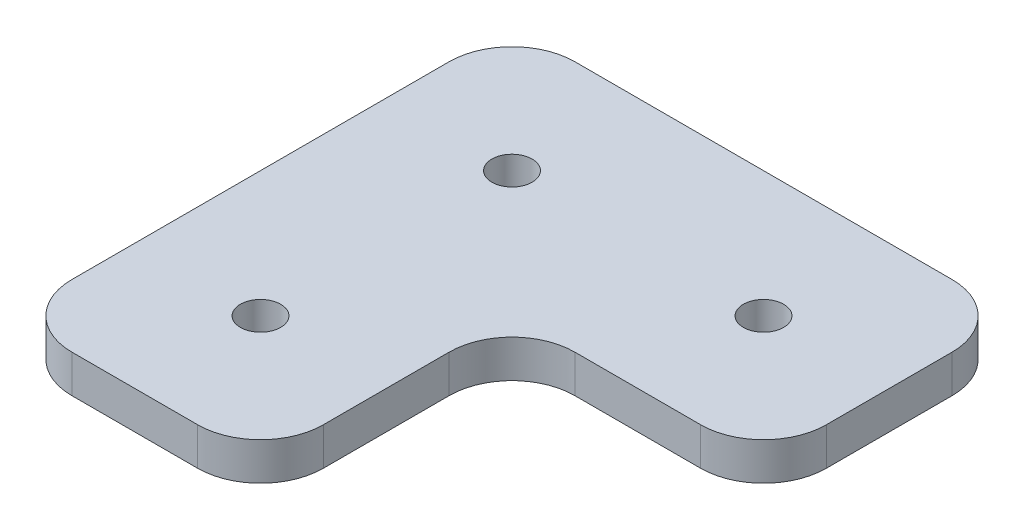
ISO-10303-21;
HEADER;
FILE_DESCRIPTION(('STEP AP214'),'2;1');
FILE_NAME('part.step','',(''),(''),'','','');
FILE_SCHEMA(('AUTOMOTIVE_DESIGN { 1 0 10303 214 1 1 1 1 }'));
ENDSEC;
DATA;
#1=APPLICATION_CONTEXT('core data for automotive mechanical design processes');
#2=APPLICATION_PROTOCOL_DEFINITION('international standard','automotive_design',2000,#1);
#3=PRODUCT_CONTEXT('',#1,'mechanical');
#4=PRODUCT('Part','Part','',(#3));
#5=PRODUCT_RELATED_PRODUCT_CATEGORY('part','',(#4));
#6=PRODUCT_DEFINITION_FORMATION('','',#4);
#7=PRODUCT_DEFINITION_CONTEXT('part definition',#1,'design');
#8=PRODUCT_DEFINITION('design','',#6,#7);
#9=PRODUCT_DEFINITION_SHAPE('','',#8);
#10=(LENGTH_UNIT() NAMED_UNIT(*) SI_UNIT(.MILLI.,.METRE.));
#11=(NAMED_UNIT(*) PLANE_ANGLE_UNIT() SI_UNIT($,.RADIAN.));
#12=(NAMED_UNIT(*) SI_UNIT($,.STERADIAN.) SOLID_ANGLE_UNIT());
#13=UNCERTAINTY_MEASURE_WITH_UNIT(LENGTH_MEASURE(1.E-05),#10,'distance_accuracy_value','');
#14=(GEOMETRIC_REPRESENTATION_CONTEXT(3) GLOBAL_UNCERTAINTY_ASSIGNED_CONTEXT((#13)) GLOBAL_UNIT_ASSIGNED_CONTEXT((#10,
#11,#12)) REPRESENTATION_CONTEXT('',''));
#15=CARTESIAN_POINT('',(0.,0.,0.));
#16=DIRECTION('',(0.,0.,1.));
#17=DIRECTION('',(1.,0.,0.));
#18=AXIS2_PLACEMENT_3D('',#15,#16,#17);
#19=CARTESIAN_POINT('',(0.,3.,0.));
#20=DIRECTION('',(0.,-1.,0.));
#21=DIRECTION('',(0.,0.,-1.));
#22=AXIS2_PLACEMENT_3D('',#19,#20,#21);
#23=PLANE('',#22);
#24=DIRECTION('',(0.,0.,1.));
#25=VECTOR('',#24,1.);
#26=CARTESIAN_POINT('',(0.,3.,0.));
#27=LINE('',#26,#25);
#28=CARTESIAN_POINT('',(0.,3.,-35.));
#29=VERTEX_POINT('',#28);
#30=CARTESIAN_POINT('',(0.,3.,-5.));
#31=VERTEX_POINT('',#30);
#32=EDGE_CURVE('E172',#29,#31,#27,.T.);
#33=ORIENTED_EDGE('',*,*,#32,.T.);
#34=CARTESIAN_POINT('',(5.,3.,-5.));
#35=DIRECTION('',(0.,-1.,0.));
#36=DIRECTION('',(0.,0.,-1.));
#37=AXIS2_PLACEMENT_3D('',#34,#35,#36);
#38=CIRCLE('',#37,5.);
#39=CARTESIAN_POINT('',(5.,3.,0.));
#40=VERTEX_POINT('',#39);
#41=EDGE_CURVE('E201',#31,#40,#38,.F.);
#42=ORIENTED_EDGE('',*,*,#41,.T.);
#43=DIRECTION('',(1.,0.,0.));
#44=VECTOR('',#43,1.);
#45=CARTESIAN_POINT('',(0.,3.,0.));
#46=LINE('',#45,#44);
#47=CARTESIAN_POINT('',(15.,3.,0.));
#48=VERTEX_POINT('',#47);
#49=EDGE_CURVE('E155',#40,#48,#46,.T.);
#50=ORIENTED_EDGE('',*,*,#49,.T.);
#51=CARTESIAN_POINT('',(15.,3.,-5.));
#52=DIRECTION('',(0.,-1.,0.));
#53=DIRECTION('',(0.,0.,-1.));
#54=AXIS2_PLACEMENT_3D('',#51,#52,#53);
#55=CIRCLE('',#54,5.);
#56=CARTESIAN_POINT('',(20.,3.,-5.));
#57=VERTEX_POINT('',#56);
#58=EDGE_CURVE('E199',#48,#57,#55,.F.);
#59=ORIENTED_EDGE('',*,*,#58,.T.);
#60=DIRECTION('',(0.,0.,-1.));
#61=VECTOR('',#60,1.);
#62=CARTESIAN_POINT('',(20.,3.,-20.));
#63=LINE('',#62,#61);
#64=CARTESIAN_POINT('',(20.,3.,-15.));
#65=VERTEX_POINT('',#64);
#66=EDGE_CURVE('E237',#57,#65,#63,.T.);
#67=ORIENTED_EDGE('',*,*,#66,.T.);
#68=CARTESIAN_POINT('',(25.,3.,-15.));
#69=DIRECTION('',(0.,-1.,0.));
#70=DIRECTION('',(0.,0.,-1.));
#71=AXIS2_PLACEMENT_3D('',#68,#69,#70);
#72=CIRCLE('',#71,5.);
#73=CARTESIAN_POINT('',(25.,3.,-20.));
#74=VERTEX_POINT('',#73);
#75=EDGE_CURVE('E11',#65,#74,#72,.T.);
#76=ORIENTED_EDGE('',*,*,#75,.T.);
#77=DIRECTION('',(1.,0.,0.));
#78=VECTOR('',#77,1.);
#79=CARTESIAN_POINT('',(40.,3.,-20.));
#80=LINE('',#79,#78);
#81=CARTESIAN_POINT('',(35.,3.,-20.));
#82=VERTEX_POINT('',#81);
#83=EDGE_CURVE('E235',#74,#82,#80,.T.);
#84=ORIENTED_EDGE('',*,*,#83,.T.);
#85=CARTESIAN_POINT('',(35.,3.,-25.));
#86=DIRECTION('',(0.,-1.,0.));
#87=DIRECTION('',(0.,0.,-1.));
#88=AXIS2_PLACEMENT_3D('',#85,#86,#87);
#89=CIRCLE('',#88,5.);
#90=CARTESIAN_POINT('',(40.,3.,-25.));
#91=VERTEX_POINT('',#90);
#92=EDGE_CURVE('E197',#82,#91,#89,.F.);
#93=ORIENTED_EDGE('',*,*,#92,.T.);
#94=DIRECTION('',(0.,0.,-1.));
#95=VECTOR('',#94,1.);
#96=CARTESIAN_POINT('',(40.,3.,-40.));
#97=LINE('',#96,#95);
#98=CARTESIAN_POINT('',(40.,3.,-35.));
#99=VERTEX_POINT('',#98);
#100=EDGE_CURVE('E241',#91,#99,#97,.T.);
#101=ORIENTED_EDGE('',*,*,#100,.T.);
#102=CARTESIAN_POINT('',(35.,3.,-35.));
#103=DIRECTION('',(0.,-1.,0.));
#104=DIRECTION('',(0.,0.,-1.));
#105=AXIS2_PLACEMENT_3D('',#102,#103,#104);
#106=CIRCLE('',#105,5.);
#107=CARTESIAN_POINT('',(35.,3.,-40.));
#108=VERTEX_POINT('',#107);
#109=EDGE_CURVE('E67',#99,#108,#106,.F.);
#110=ORIENTED_EDGE('',*,*,#109,.T.);
#111=DIRECTION('',(-1.,0.,0.));
#112=VECTOR('',#111,1.);
#113=CARTESIAN_POINT('',(0.,3.,-40.));
#114=LINE('',#113,#112);
#115=CARTESIAN_POINT('',(5.,3.,-40.));
#116=VERTEX_POINT('',#115);
#117=EDGE_CURVE('E243',#108,#116,#114,.T.);
#118=ORIENTED_EDGE('',*,*,#117,.T.);
#119=CARTESIAN_POINT('',(5.,3.,-35.));
#120=DIRECTION('',(0.,-1.,0.));
#121=DIRECTION('',(0.,0.,-1.));
#122=AXIS2_PLACEMENT_3D('',#119,#120,#121);
#123=CIRCLE('',#122,5.);
#124=EDGE_CURVE('E194',#116,#29,#123,.F.);
#125=ORIENTED_EDGE('',*,*,#124,.T.);
#126=EDGE_LOOP('',(#33,#42,#50,#59,#67,#76,#84,#93,#101,#110,#118,#125));
#127=FACE_BOUND('',#126,.T.);
#128=CARTESIAN_POINT('',(30.,3.,-30.));
#129=DIRECTION('',(0.,1.,0.));
#130=DIRECTION('',(0.,0.,1.));
#131=AXIS2_PLACEMENT_3D('',#128,#129,#130);
#132=CIRCLE('',#131,1.6);
#133=CARTESIAN_POINT('',(30.,3.,-28.4));
#134=VERTEX_POINT('',#133);
#135=EDGE_CURVE('E163',#134,#134,#132,.T.);
#136=ORIENTED_EDGE('',*,*,#135,.F.);
#137=EDGE_LOOP('',(#136));
#138=FACE_BOUND('',#137,.T.);
#139=CARTESIAN_POINT('',(9.99999999999999,3.,-30.));
#140=DIRECTION('',(0.,1.,0.));
#141=DIRECTION('',(0.,0.,1.));
#142=AXIS2_PLACEMENT_3D('',#139,#140,#141);
#143=CIRCLE('',#142,1.6);
#144=CARTESIAN_POINT('',(9.99999999999999,3.,-28.4));
#145=VERTEX_POINT('',#144);
#146=EDGE_CURVE('E324',#145,#145,#143,.T.);
#147=ORIENTED_EDGE('',*,*,#146,.F.);
#148=EDGE_LOOP('',(#147));
#149=FACE_BOUND('',#148,.T.);
#150=CARTESIAN_POINT('',(10.,3.,-9.99999999999999));
#151=DIRECTION('',(0.,1.,0.));
#152=DIRECTION('',(0.,0.,1.));
#153=AXIS2_PLACEMENT_3D('',#150,#151,#152);
#154=CIRCLE('',#153,1.6);
#155=CARTESIAN_POINT('',(10.,3.,-8.39999999999999));
#156=VERTEX_POINT('',#155);
#157=EDGE_CURVE('E315',#156,#156,#154,.T.);
#158=ORIENTED_EDGE('',*,*,#157,.F.);
#159=EDGE_LOOP('',(#158));
#160=FACE_BOUND('',#159,.T.);
#161=ADVANCED_FACE('F45',(#127,#138,#149,#160),#23,.F.);
#162=CARTESIAN_POINT('',(0.,0.,0.));
#163=DIRECTION('',(0.,-1.,0.));
#164=DIRECTION('',(0.,0.,-1.));
#165=AXIS2_PLACEMENT_3D('',#162,#163,#164);
#166=PLANE('',#165);
#167=CARTESIAN_POINT('',(9.99999999999999,0.,-30.));
#168=DIRECTION('',(0.,1.,0.));
#169=DIRECTION('',(0.,0.,1.));
#170=AXIS2_PLACEMENT_3D('',#167,#168,#169);
#171=CIRCLE('',#170,1.6);
#172=CARTESIAN_POINT('',(9.99999999999999,0.,-28.4));
#173=VERTEX_POINT('',#172);
#174=EDGE_CURVE('E321',#173,#173,#171,.T.);
#175=ORIENTED_EDGE('',*,*,#174,.T.);
#176=EDGE_LOOP('',(#175));
#177=FACE_BOUND('',#176,.T.);
#178=DIRECTION('',(1.,0.,0.));
#179=VECTOR('',#178,1.);
#180=CARTESIAN_POINT('',(0.,0.,0.));
#181=LINE('',#180,#179);
#182=CARTESIAN_POINT('',(5.,0.,0.));
#183=VERTEX_POINT('',#182);
#184=CARTESIAN_POINT('',(15.,0.,0.));
#185=VERTEX_POINT('',#184);
#186=EDGE_CURVE('E152',#183,#185,#181,.T.);
#187=ORIENTED_EDGE('',*,*,#186,.F.);
#188=CARTESIAN_POINT('',(5.,0.,-5.));
#189=DIRECTION('',(0.,-1.,0.));
#190=DIRECTION('',(0.,0.,-1.));
#191=AXIS2_PLACEMENT_3D('',#188,#189,#190);
#192=CIRCLE('',#191,5.);
#193=CARTESIAN_POINT('',(0.,0.,-5.));
#194=VERTEX_POINT('',#193);
#195=EDGE_CURVE('E135',#183,#194,#192,.T.);
#196=ORIENTED_EDGE('',*,*,#195,.T.);
#197=DIRECTION('',(0.,0.,1.));
#198=VECTOR('',#197,1.);
#199=CARTESIAN_POINT('',(0.,0.,0.));
#200=LINE('',#199,#198);
#201=CARTESIAN_POINT('',(0.,0.,-35.));
#202=VERTEX_POINT('',#201);
#203=EDGE_CURVE('E182',#202,#194,#200,.T.);
#204=ORIENTED_EDGE('',*,*,#203,.F.);
#205=CARTESIAN_POINT('',(5.,0.,-35.));
#206=DIRECTION('',(0.,-1.,0.));
#207=DIRECTION('',(0.,0.,-1.));
#208=AXIS2_PLACEMENT_3D('',#205,#206,#207);
#209=CIRCLE('',#208,5.);
#210=CARTESIAN_POINT('',(5.,0.,-40.));
#211=VERTEX_POINT('',#210);
#212=EDGE_CURVE('E156',#202,#211,#209,.T.);
#213=ORIENTED_EDGE('',*,*,#212,.T.);
#214=DIRECTION('',(-1.,0.,0.));
#215=VECTOR('',#214,1.);
#216=CARTESIAN_POINT('',(0.,0.,-40.));
#217=LINE('',#216,#215);
#218=CARTESIAN_POINT('',(35.,0.,-40.));
#219=VERTEX_POINT('',#218);
#220=EDGE_CURVE('E180',#219,#211,#217,.T.);
#221=ORIENTED_EDGE('',*,*,#220,.F.);
#222=CARTESIAN_POINT('',(35.,0.,-35.));
#223=DIRECTION('',(0.,-1.,0.));
#224=DIRECTION('',(0.,0.,-1.));
#225=AXIS2_PLACEMENT_3D('',#222,#223,#224);
#226=CIRCLE('',#225,5.);
#227=CARTESIAN_POINT('',(40.,0.,-35.));
#228=VERTEX_POINT('',#227);
#229=EDGE_CURVE('E186',#219,#228,#226,.T.);
#230=ORIENTED_EDGE('',*,*,#229,.T.);
#231=DIRECTION('',(0.,0.,-1.));
#232=VECTOR('',#231,1.);
#233=CARTESIAN_POINT('',(40.,0.,-40.));
#234=LINE('',#233,#232);
#235=CARTESIAN_POINT('',(40.,0.,-25.));
#236=VERTEX_POINT('',#235);
#237=EDGE_CURVE('E177',#236,#228,#234,.T.);
#238=ORIENTED_EDGE('',*,*,#237,.F.);
#239=CARTESIAN_POINT('',(35.,0.,-25.));
#240=DIRECTION('',(0.,-1.,0.));
#241=DIRECTION('',(0.,0.,-1.));
#242=AXIS2_PLACEMENT_3D('',#239,#240,#241);
#243=CIRCLE('',#242,5.);
#244=CARTESIAN_POINT('',(35.,0.,-20.));
#245=VERTEX_POINT('',#244);
#246=EDGE_CURVE('E188',#236,#245,#243,.T.);
#247=ORIENTED_EDGE('',*,*,#246,.T.);
#248=DIRECTION('',(1.,0.,0.));
#249=VECTOR('',#248,1.);
#250=CARTESIAN_POINT('',(40.,0.,-20.));
#251=LINE('',#250,#249);
#252=CARTESIAN_POINT('',(25.,0.,-20.));
#253=VERTEX_POINT('',#252);
#254=EDGE_CURVE('E166',#253,#245,#251,.T.);
#255=ORIENTED_EDGE('',*,*,#254,.F.);
#256=CARTESIAN_POINT('',(25.,0.,-15.));
#257=DIRECTION('',(0.,-1.,0.));
#258=DIRECTION('',(0.,0.,-1.));
#259=AXIS2_PLACEMENT_3D('',#256,#257,#258);
#260=CIRCLE('',#259,5.);
#261=CARTESIAN_POINT('',(20.,0.,-15.));
#262=VERTEX_POINT('',#261);
#263=EDGE_CURVE('E53',#253,#262,#260,.F.);
#264=ORIENTED_EDGE('',*,*,#263,.T.);
#265=DIRECTION('',(0.,0.,-1.));
#266=VECTOR('',#265,1.);
#267=CARTESIAN_POINT('',(20.,0.,-20.));
#268=LINE('',#267,#266);
#269=CARTESIAN_POINT('',(20.,0.,-5.));
#270=VERTEX_POINT('',#269);
#271=EDGE_CURVE('E162',#270,#262,#268,.T.);
#272=ORIENTED_EDGE('',*,*,#271,.F.);
#273=CARTESIAN_POINT('',(15.,0.,-5.));
#274=DIRECTION('',(0.,-1.,0.));
#275=DIRECTION('',(0.,0.,-1.));
#276=AXIS2_PLACEMENT_3D('',#273,#274,#275);
#277=CIRCLE('',#276,5.);
#278=EDGE_CURVE('E146',#270,#185,#277,.T.);
#279=ORIENTED_EDGE('',*,*,#278,.T.);
#280=EDGE_LOOP('',(#187,#196,#204,#213,#221,#230,#238,#247,#255,#264,#272,#279));
#281=FACE_BOUND('',#280,.T.);
#282=CARTESIAN_POINT('',(30.,0.,-30.));
#283=DIRECTION('',(0.,1.,0.));
#284=DIRECTION('',(0.,0.,1.));
#285=AXIS2_PLACEMENT_3D('',#282,#283,#284);
#286=CIRCLE('',#285,1.6);
#287=CARTESIAN_POINT('',(30.,0.,-28.4));
#288=VERTEX_POINT('',#287);
#289=EDGE_CURVE('E169',#288,#288,#286,.T.);
#290=ORIENTED_EDGE('',*,*,#289,.T.);
#291=EDGE_LOOP('',(#290));
#292=FACE_BOUND('',#291,.T.);
#293=CARTESIAN_POINT('',(10.,0.,-9.99999999999999));
#294=DIRECTION('',(0.,1.,0.));
#295=DIRECTION('',(0.,0.,1.));
#296=AXIS2_PLACEMENT_3D('',#293,#294,#295);
#297=CIRCLE('',#296,1.6);
#298=CARTESIAN_POINT('',(10.,0.,-8.39999999999999));
#299=VERTEX_POINT('',#298);
#300=EDGE_CURVE('E318',#299,#299,#297,.T.);
#301=ORIENTED_EDGE('',*,*,#300,.T.);
#302=EDGE_LOOP('',(#301));
#303=FACE_BOUND('',#302,.T.);
#304=ADVANCED_FACE('F159',(#177,#281,#292,#303),#166,.T.);
#305=CARTESIAN_POINT('',(0.,3.,0.));
#306=DIRECTION('',(0.,0.,-1.));
#307=DIRECTION('',(-1.,0.,0.));
#308=AXIS2_PLACEMENT_3D('',#305,#306,#307);
#309=PLANE('',#308);
#310=ORIENTED_EDGE('',*,*,#49,.F.);
#311=DIRECTION('',(0.,-1.,0.));
#312=VECTOR('',#311,1.);
#313=CARTESIAN_POINT('',(5.,3.,0.));
#314=LINE('',#313,#312);
#315=EDGE_CURVE('E139',#40,#183,#314,.T.);
#316=ORIENTED_EDGE('',*,*,#315,.T.);
#317=ORIENTED_EDGE('',*,*,#186,.T.);
#318=DIRECTION('',(0.,-1.,0.));
#319=VECTOR('',#318,1.);
#320=CARTESIAN_POINT('',(15.,3.,0.));
#321=LINE('',#320,#319);
#322=EDGE_CURVE('E157',#185,#48,#321,.F.);
#323=ORIENTED_EDGE('',*,*,#322,.T.);
#324=EDGE_LOOP('',(#310,#316,#317,#323));
#325=FACE_BOUND('',#324,.T.);
#326=ADVANCED_FACE('F151',(#325),#309,.F.);
#327=CARTESIAN_POINT('',(20.,3.,-20.));
#328=DIRECTION('',(-1.,0.,0.));
#329=DIRECTION('',(0.,0.,1.));
#330=AXIS2_PLACEMENT_3D('',#327,#328,#329);
#331=PLANE('',#330);
#332=ORIENTED_EDGE('',*,*,#66,.F.);
#333=DIRECTION('',(0.,-1.,0.));
#334=VECTOR('',#333,1.);
#335=CARTESIAN_POINT('',(20.,3.,-5.));
#336=LINE('',#335,#334);
#337=EDGE_CURVE('E205',#57,#270,#336,.T.);
#338=ORIENTED_EDGE('',*,*,#337,.T.);
#339=ORIENTED_EDGE('',*,*,#271,.T.);
#340=DIRECTION('',(0.,-1.,0.));
#341=VECTOR('',#340,1.);
#342=CARTESIAN_POINT('',(20.,3.,-15.));
#343=LINE('',#342,#341);
#344=EDGE_CURVE('E203',#262,#65,#343,.F.);
#345=ORIENTED_EDGE('',*,*,#344,.T.);
#346=EDGE_LOOP('',(#332,#338,#339,#345));
#347=FACE_BOUND('',#346,.T.);
#348=ADVANCED_FACE('F227',(#347),#331,.F.);
#349=CARTESIAN_POINT('',(40.,3.,-20.));
#350=DIRECTION('',(0.,0.,-1.));
#351=DIRECTION('',(-1.,0.,0.));
#352=AXIS2_PLACEMENT_3D('',#349,#350,#351);
#353=PLANE('',#352);
#354=ORIENTED_EDGE('',*,*,#254,.T.);
#355=DIRECTION('',(0.,-1.,0.));
#356=VECTOR('',#355,1.);
#357=CARTESIAN_POINT('',(35.,3.,-20.));
#358=LINE('',#357,#356);
#359=EDGE_CURVE('E216',#245,#82,#358,.F.);
#360=ORIENTED_EDGE('',*,*,#359,.T.);
#361=ORIENTED_EDGE('',*,*,#83,.F.);
#362=DIRECTION('',(0.,-1.,0.));
#363=VECTOR('',#362,1.);
#364=CARTESIAN_POINT('',(25.,0.,-20.));
#365=LINE('',#364,#363);
#366=EDGE_CURVE('E213',#74,#253,#365,.T.);
#367=ORIENTED_EDGE('',*,*,#366,.T.);
#368=EDGE_LOOP('',(#354,#360,#361,#367));
#369=FACE_BOUND('',#368,.T.);
#370=ADVANCED_FACE('F239',(#369),#353,.F.);
#371=CARTESIAN_POINT('',(40.,3.,-40.));
#372=DIRECTION('',(-1.,0.,0.));
#373=DIRECTION('',(0.,0.,1.));
#374=AXIS2_PLACEMENT_3D('',#371,#372,#373);
#375=PLANE('',#374);
#376=ORIENTED_EDGE('',*,*,#100,.F.);
#377=DIRECTION('',(0.,-1.,0.));
#378=VECTOR('',#377,1.);
#379=CARTESIAN_POINT('',(40.,3.,-25.));
#380=LINE('',#379,#378);
#381=EDGE_CURVE('E210',#91,#236,#380,.T.);
#382=ORIENTED_EDGE('',*,*,#381,.T.);
#383=ORIENTED_EDGE('',*,*,#237,.T.);
#384=DIRECTION('',(0.,-1.,0.));
#385=VECTOR('',#384,1.);
#386=CARTESIAN_POINT('',(40.,3.,-35.));
#387=LINE('',#386,#385);
#388=EDGE_CURVE('E208',#228,#99,#387,.F.);
#389=ORIENTED_EDGE('',*,*,#388,.T.);
#390=EDGE_LOOP('',(#376,#382,#383,#389));
#391=FACE_BOUND('',#390,.T.);
#392=ADVANCED_FACE('F263',(#391),#375,.F.);
#393=CARTESIAN_POINT('',(0.,3.,-40.));
#394=DIRECTION('',(0.,0.,1.));
#395=DIRECTION('',(1.,0.,0.));
#396=AXIS2_PLACEMENT_3D('',#393,#394,#395);
#397=PLANE('',#396);
#398=ORIENTED_EDGE('',*,*,#117,.F.);
#399=DIRECTION('',(0.,-1.,0.));
#400=VECTOR('',#399,1.);
#401=CARTESIAN_POINT('',(35.,3.,-40.));
#402=LINE('',#401,#400);
#403=EDGE_CURVE('E219',#108,#219,#402,.T.);
#404=ORIENTED_EDGE('',*,*,#403,.T.);
#405=ORIENTED_EDGE('',*,*,#220,.T.);
#406=DIRECTION('',(0.,-1.,0.));
#407=VECTOR('',#406,1.);
#408=CARTESIAN_POINT('',(5.,3.,-40.));
#409=LINE('',#408,#407);
#410=EDGE_CURVE('E60',#211,#116,#409,.F.);
#411=ORIENTED_EDGE('',*,*,#410,.T.);
#412=EDGE_LOOP('',(#398,#404,#405,#411));
#413=FACE_BOUND('',#412,.T.);
#414=ADVANCED_FACE('F255',(#413),#397,.F.);
#415=CARTESIAN_POINT('',(0.,3.,0.));
#416=DIRECTION('',(1.,0.,0.));
#417=DIRECTION('',(0.,0.,-1.));
#418=AXIS2_PLACEMENT_3D('',#415,#416,#417);
#419=PLANE('',#418);
#420=ORIENTED_EDGE('',*,*,#203,.T.);
#421=DIRECTION('',(0.,-1.,0.));
#422=VECTOR('',#421,1.);
#423=CARTESIAN_POINT('',(0.,3.,-5.));
#424=LINE('',#423,#422);
#425=EDGE_CURVE('E140',#194,#31,#424,.F.);
#426=ORIENTED_EDGE('',*,*,#425,.T.);
#427=ORIENTED_EDGE('',*,*,#32,.F.);
#428=DIRECTION('',(0.,-1.,0.));
#429=VECTOR('',#428,1.);
#430=CARTESIAN_POINT('',(0.,3.,-35.));
#431=LINE('',#430,#429);
#432=EDGE_CURVE('E145',#29,#202,#431,.T.);
#433=ORIENTED_EDGE('',*,*,#432,.T.);
#434=EDGE_LOOP('',(#420,#426,#427,#433));
#435=FACE_BOUND('',#434,.T.);
#436=ADVANCED_FACE('F251',(#435),#419,.F.);
#437=CARTESIAN_POINT('',(30.,3.,-30.));
#438=DIRECTION('',(0.,-1.,0.));
#439=DIRECTION('',(0.,0.,-1.));
#440=AXIS2_PLACEMENT_3D('',#437,#438,#439);
#441=CYLINDRICAL_SURFACE('',#440,1.6);
#442=ORIENTED_EDGE('',*,*,#135,.T.);
#443=EDGE_LOOP('',(#442));
#444=FACE_BOUND('',#443,.T.);
#445=ORIENTED_EDGE('',*,*,#289,.F.);
#446=EDGE_LOOP('',(#445));
#447=FACE_BOUND('',#446,.T.);
#448=ADVANCED_FACE('F286',(#444,#447),#441,.F.);
#449=CARTESIAN_POINT('',(9.99999999999999,3.,-30.));
#450=DIRECTION('',(0.,-1.,0.));
#451=DIRECTION('',(0.,0.,-1.));
#452=AXIS2_PLACEMENT_3D('',#449,#450,#451);
#453=CYLINDRICAL_SURFACE('',#452,1.6);
#454=ORIENTED_EDGE('',*,*,#146,.T.);
#455=EDGE_LOOP('',(#454));
#456=FACE_BOUND('',#455,.T.);
#457=ORIENTED_EDGE('',*,*,#174,.F.);
#458=EDGE_LOOP('',(#457));
#459=FACE_BOUND('',#458,.T.);
#460=ADVANCED_FACE('F305',(#456,#459),#453,.F.);
#461=CARTESIAN_POINT('',(10.,3.,-9.99999999999999));
#462=DIRECTION('',(0.,-1.,0.));
#463=DIRECTION('',(0.,0.,-1.));
#464=AXIS2_PLACEMENT_3D('',#461,#462,#463);
#465=CYLINDRICAL_SURFACE('',#464,1.6);
#466=ORIENTED_EDGE('',*,*,#157,.T.);
#467=EDGE_LOOP('',(#466));
#468=FACE_BOUND('',#467,.T.);
#469=ORIENTED_EDGE('',*,*,#300,.F.);
#470=EDGE_LOOP('',(#469));
#471=FACE_BOUND('',#470,.T.);
#472=ADVANCED_FACE('F302',(#468,#471),#465,.F.);
#473=CARTESIAN_POINT('',(5.,3.,-5.));
#474=DIRECTION('',(0.,-1.,0.));
#475=DIRECTION('',(0.,0.,-1.));
#476=AXIS2_PLACEMENT_3D('',#473,#474,#475);
#477=CYLINDRICAL_SURFACE('',#476,5.);
#478=ORIENTED_EDGE('',*,*,#41,.F.);
#479=ORIENTED_EDGE('',*,*,#425,.F.);
#480=ORIENTED_EDGE('',*,*,#195,.F.);
#481=ORIENTED_EDGE('',*,*,#315,.F.);
#482=EDGE_LOOP('',(#478,#479,#480,#481));
#483=FACE_BOUND('',#482,.T.);
#484=ADVANCED_FACE('F138',(#483),#477,.T.);
#485=CARTESIAN_POINT('',(15.,3.,-5.));
#486=DIRECTION('',(0.,-1.,0.));
#487=DIRECTION('',(0.,0.,-1.));
#488=AXIS2_PLACEMENT_3D('',#485,#486,#487);
#489=CYLINDRICAL_SURFACE('',#488,5.);
#490=ORIENTED_EDGE('',*,*,#58,.F.);
#491=ORIENTED_EDGE('',*,*,#322,.F.);
#492=ORIENTED_EDGE('',*,*,#278,.F.);
#493=ORIENTED_EDGE('',*,*,#337,.F.);
#494=EDGE_LOOP('',(#490,#491,#492,#493));
#495=FACE_BOUND('',#494,.T.);
#496=ADVANCED_FACE('F268',(#495),#489,.T.);
#497=CARTESIAN_POINT('',(35.,3.,-25.));
#498=DIRECTION('',(0.,-1.,0.));
#499=DIRECTION('',(0.,0.,-1.));
#500=AXIS2_PLACEMENT_3D('',#497,#498,#499);
#501=CYLINDRICAL_SURFACE('',#500,5.);
#502=ORIENTED_EDGE('',*,*,#92,.F.);
#503=ORIENTED_EDGE('',*,*,#359,.F.);
#504=ORIENTED_EDGE('',*,*,#246,.F.);
#505=ORIENTED_EDGE('',*,*,#381,.F.);
#506=EDGE_LOOP('',(#502,#503,#504,#505));
#507=FACE_BOUND('',#506,.T.);
#508=ADVANCED_FACE('F266',(#507),#501,.T.);
#509=CARTESIAN_POINT('',(35.,3.,-35.));
#510=DIRECTION('',(0.,-1.,0.));
#511=DIRECTION('',(0.,0.,-1.));
#512=AXIS2_PLACEMENT_3D('',#509,#510,#511);
#513=CYLINDRICAL_SURFACE('',#512,5.);
#514=ORIENTED_EDGE('',*,*,#109,.F.);
#515=ORIENTED_EDGE('',*,*,#388,.F.);
#516=ORIENTED_EDGE('',*,*,#229,.F.);
#517=ORIENTED_EDGE('',*,*,#403,.F.);
#518=EDGE_LOOP('',(#514,#515,#516,#517));
#519=FACE_BOUND('',#518,.T.);
#520=ADVANCED_FACE('F258',(#519),#513,.T.);
#521=CARTESIAN_POINT('',(5.,3.,-35.));
#522=DIRECTION('',(0.,-1.,0.));
#523=DIRECTION('',(0.,0.,-1.));
#524=AXIS2_PLACEMENT_3D('',#521,#522,#523);
#525=CYLINDRICAL_SURFACE('',#524,5.);
#526=ORIENTED_EDGE('',*,*,#124,.F.);
#527=ORIENTED_EDGE('',*,*,#410,.F.);
#528=ORIENTED_EDGE('',*,*,#212,.F.);
#529=ORIENTED_EDGE('',*,*,#432,.F.);
#530=EDGE_LOOP('',(#526,#527,#528,#529));
#531=FACE_BOUND('',#530,.T.);
#532=ADVANCED_FACE('F253',(#531),#525,.T.);
#533=CARTESIAN_POINT('',(25.,3.,-15.));
#534=DIRECTION('',(0.,1.,0.));
#535=DIRECTION('',(0.,0.,1.));
#536=AXIS2_PLACEMENT_3D('',#533,#534,#535);
#537=CYLINDRICAL_SURFACE('',#536,5.);
#538=ORIENTED_EDGE('',*,*,#75,.F.);
#539=ORIENTED_EDGE('',*,*,#344,.F.);
#540=ORIENTED_EDGE('',*,*,#263,.F.);
#541=ORIENTED_EDGE('',*,*,#366,.F.);
#542=EDGE_LOOP('',(#538,#539,#540,#541));
#543=FACE_BOUND('',#542,.T.);
#544=ADVANCED_FACE('F47',(#543),#537,.F.);
#545=CLOSED_SHELL('',(#161,#304,#326,#348,#370,#392,#414,#436,#448,#460,#472,#484,#496,#508,
#520,#532,#544));
#546=MANIFOLD_SOLID_BREP('B2',#545);
#547=ADVANCED_BREP_SHAPE_REPRESENTATION('',(#18,#546),#14);
#548=SHAPE_DEFINITION_REPRESENTATION(#9,#547);
ENDSEC;
END-ISO-10303-21;
